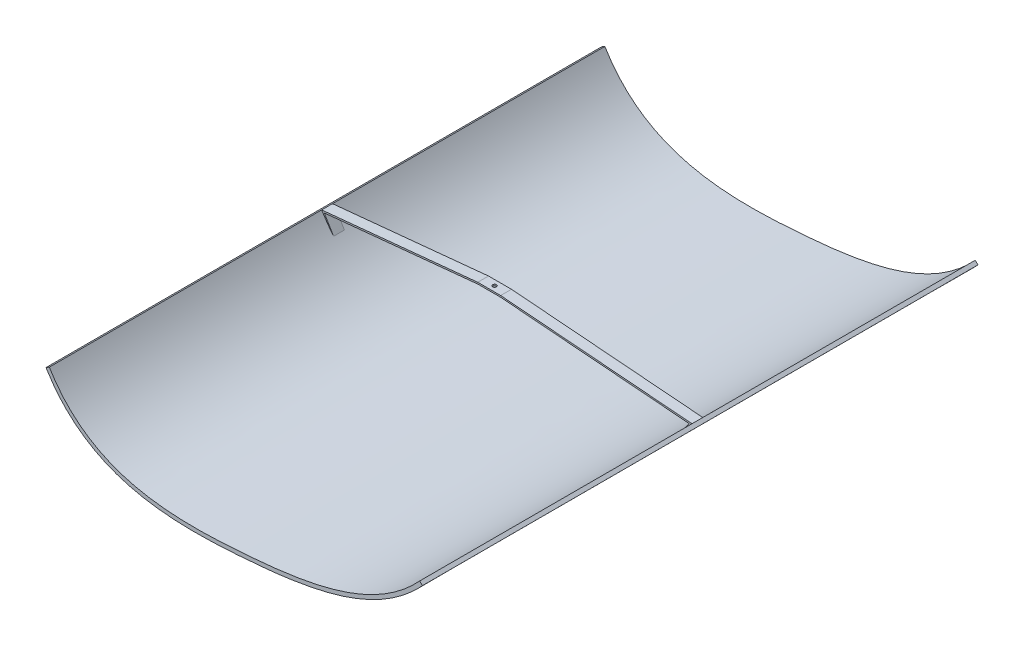
ISO-10303-21;
HEADER;
FILE_DESCRIPTION(('STEP AP214'),'2;1');
FILE_NAME('part.step','',(''),(''),'','','');
FILE_SCHEMA(('AUTOMOTIVE_DESIGN { 1 0 10303 214 1 1 1 1 }'));
ENDSEC;
DATA;
#1=APPLICATION_CONTEXT('core data for automotive mechanical design processes');
#2=APPLICATION_PROTOCOL_DEFINITION('international standard','automotive_design',2000,#1);
#3=PRODUCT_CONTEXT('',#1,'mechanical');
#4=PRODUCT('Part','Part','',(#3));
#5=PRODUCT_RELATED_PRODUCT_CATEGORY('part','',(#4));
#6=PRODUCT_DEFINITION_FORMATION('','',#4);
#7=PRODUCT_DEFINITION_CONTEXT('part definition',#1,'design');
#8=PRODUCT_DEFINITION('design','',#6,#7);
#9=PRODUCT_DEFINITION_SHAPE('','',#8);
#10=(LENGTH_UNIT() NAMED_UNIT(*) SI_UNIT(.MILLI.,.METRE.));
#11=(NAMED_UNIT(*) PLANE_ANGLE_UNIT() SI_UNIT($,.RADIAN.));
#12=(NAMED_UNIT(*) SI_UNIT($,.STERADIAN.) SOLID_ANGLE_UNIT());
#13=UNCERTAINTY_MEASURE_WITH_UNIT(LENGTH_MEASURE(1.E-05),#10,'distance_accuracy_value','');
#14=(GEOMETRIC_REPRESENTATION_CONTEXT(3) GLOBAL_UNCERTAINTY_ASSIGNED_CONTEXT((#13)) GLOBAL_UNIT_ASSIGNED_CONTEXT((#10,
#11,#12)) REPRESENTATION_CONTEXT('',''));
#15=CARTESIAN_POINT('',(0.,0.,0.));
#16=DIRECTION('',(0.,0.,1.));
#17=DIRECTION('',(1.,0.,0.));
#18=AXIS2_PLACEMENT_3D('',#15,#16,#17);
#19=CARTESIAN_POINT('',(-284.716135490118,-3.28498933828445,914.4));
#20=CARTESIAN_POINT('',(-276.411980171284,-17.0223440769889,914.4));
#21=CARTESIAN_POINT('',(-267.229584335889,-29.2024452882154,914.4));
#22=CARTESIAN_POINT('',(-247.338960844286,-50.7240263520773,914.4));
#23=CARTESIAN_POINT('',(-236.63146433516,-60.0642705488544,914.4));
#24=CARTESIAN_POINT('',(-213.956642450282,-76.1993515181385,914.4));
#25=CARTESIAN_POINT('',(-201.990613754382,-82.9942455509838,914.4));
#26=CARTESIAN_POINT('',(-177.065513095476,-94.373588625778,914.4));
#27=CARTESIAN_POINT('',(-164.106747151635,-98.9589092430839,914.4));
#28=CARTESIAN_POINT('',(-137.435337906107,-106.278074264597,914.4));
#29=CARTESIAN_POINT('',(-123.722298844139,-109.012434746504,914.4));
#30=CARTESIAN_POINT('',(-95.7575404753767,-112.988332752514,914.4));
#31=CARTESIAN_POINT('',(-81.5054413403796,-114.229947252524,914.4));
#32=CARTESIAN_POINT('',(-38.2488208925515,-116.240274168026,914.4));
#33=CARTESIAN_POINT('',(-8.74218363582349,-115.296775681338,914.4));
#34=CARTESIAN_POINT('',(27.9507179716041,-112.960198025047,914.4));
#35=CARTESIAN_POINT('',(35.2787920719414,-112.434976438823,914.4));
#36=CARTESIAN_POINT('',(49.8932412438578,-111.309686323291,914.4));
#37=CARTESIAN_POINT('',(57.1884339157507,-110.707434609322,914.4));
#38=CARTESIAN_POINT('',(79.0132676113584,-108.733315329445,914.4));
#39=CARTESIAN_POINT('',(93.4821538183719,-107.194182238308,914.4));
#40=CARTESIAN_POINT('',(136.449530574275,-101.516065662464,914.4));
#41=CARTESIAN_POINT('',(164.510554880142,-96.3182673204773,914.4));
#42=CARTESIAN_POINT('',(204.929228546462,-84.8052344162597,914.4));
#43=CARTESIAN_POINT('',(218.12301669191,-80.347603619285,914.4));
#44=CARTESIAN_POINT('',(243.810120822204,-69.9225901114651,914.4));
#45=CARTESIAN_POINT('',(256.30350073932,-63.9549464320951,914.4));
#46=CARTESIAN_POINT('',(280.43644047674,-50.2434535762098,914.4));
#47=CARTESIAN_POINT('',(292.075782994841,-42.4993308631992,914.4));
#48=CARTESIAN_POINT('',(314.337533524157,-24.9808423082727,914.4));
#49=CARTESIAN_POINT('',(324.959480173604,-15.2065106312622,914.4));
#50=CARTESIAN_POINT('',(334.991900125826,-4.29865815558271,914.4));
#51=B_SPLINE_CURVE_WITH_KNOTS('',3,(#19,#20,#21,#22,#23,#24,#25,#26,#27,#28,#29,#30,#31,#32,#33,
#34,#35,#36,#37,#38,#39,#40,#41,#42,#43,#44,#45,#46,#47,#48,#49,#50),.UNSPECIFIED.,.F.,.F.,(4,2,
2,2,2,2,2,2,2,2,2,2,2,2,2,4),(0.,0.0625,0.125,0.1875,0.25,0.3125,0.375,0.5,0.53125,0.5625,0.625,
0.75,0.8125,0.875,0.9375,1.),.UNSPECIFIED.);
#52=DIRECTION('',(0.,0.,-1.));
#53=VECTOR('',#52,1.);
#54=SURFACE_OF_LINEAR_EXTRUSION('',#51,#53);
#55=CARTESIAN_POINT('',(-284.716135490118,-3.28498933828445,0.));
#56=CARTESIAN_POINT('',(-276.411980171284,-17.0223440769889,0.));
#57=CARTESIAN_POINT('',(-267.229584335889,-29.2024452882154,0.));
#58=CARTESIAN_POINT('',(-247.338960844286,-50.7240263520773,0.));
#59=CARTESIAN_POINT('',(-236.63146433516,-60.0642705488544,0.));
#60=CARTESIAN_POINT('',(-213.956642450282,-76.1993515181385,0.));
#61=CARTESIAN_POINT('',(-201.990613754382,-82.9942455509838,0.));
#62=CARTESIAN_POINT('',(-177.065513095476,-94.373588625778,0.));
#63=CARTESIAN_POINT('',(-164.106747151635,-98.9589092430839,0.));
#64=CARTESIAN_POINT('',(-137.435337906107,-106.278074264597,0.));
#65=CARTESIAN_POINT('',(-123.722298844139,-109.012434746504,0.));
#66=CARTESIAN_POINT('',(-95.7575404753767,-112.988332752514,0.));
#67=CARTESIAN_POINT('',(-81.5054413403796,-114.229947252524,0.));
#68=CARTESIAN_POINT('',(-38.2488208925515,-116.240274168026,0.));
#69=CARTESIAN_POINT('',(-8.74218363582349,-115.296775681338,0.));
#70=CARTESIAN_POINT('',(27.9507179716041,-112.960198025047,0.));
#71=CARTESIAN_POINT('',(35.2787920719414,-112.434976438823,0.));
#72=CARTESIAN_POINT('',(49.8932412438578,-111.309686323291,0.));
#73=CARTESIAN_POINT('',(57.1884339157507,-110.707434609322,0.));
#74=CARTESIAN_POINT('',(79.0132676113584,-108.733315329445,0.));
#75=CARTESIAN_POINT('',(93.4821538183719,-107.194182238308,0.));
#76=CARTESIAN_POINT('',(136.449530574275,-101.516065662464,0.));
#77=CARTESIAN_POINT('',(164.510554880142,-96.3182673204773,0.));
#78=CARTESIAN_POINT('',(204.929228546462,-84.8052344162597,0.));
#79=CARTESIAN_POINT('',(218.12301669191,-80.347603619285,0.));
#80=CARTESIAN_POINT('',(243.810120822204,-69.9225901114651,0.));
#81=CARTESIAN_POINT('',(256.30350073932,-63.9549464320951,0.));
#82=CARTESIAN_POINT('',(280.43644047674,-50.2434535762098,0.));
#83=CARTESIAN_POINT('',(292.075782994841,-42.4993308631992,0.));
#84=CARTESIAN_POINT('',(314.337533524157,-24.9808423082727,0.));
#85=CARTESIAN_POINT('',(324.959480173604,-15.2065106312622,0.));
#86=CARTESIAN_POINT('',(334.991900125826,-4.29865815558271,0.));
#87=B_SPLINE_CURVE_WITH_KNOTS('',3,(#55,#56,#57,#58,#59,#60,#61,#62,#63,#64,#65,#66,#67,#68,#69,
#70,#71,#72,#73,#74,#75,#76,#77,#78,#79,#80,#81,#82,#83,#84,#85,#86),.UNSPECIFIED.,.F.,.F.,(4,2,
2,2,2,2,2,2,2,2,2,2,2,2,2,4),(0.,0.0625,0.125,0.1875,0.25,0.3125,0.375,0.5,0.53125,0.5625,0.625,
0.75,0.8125,0.875,0.9375,1.),.UNSPECIFIED.);
#88=CARTESIAN_POINT('',(-284.716135490118,-3.28498933828445,0.));
#89=VERTEX_POINT('',#88);
#90=CARTESIAN_POINT('',(334.991900125826,-4.29865815558276,0.));
#91=VERTEX_POINT('',#90);
#92=EDGE_CURVE('E279',#89,#91,#87,.T.);
#93=ORIENTED_EDGE('',*,*,#92,.T.);
#94=DIRECTION('',(0.,0.,-1.));
#95=VECTOR('',#94,1.);
#96=CARTESIAN_POINT('',(334.991900125826,-4.29865815558276,914.4));
#97=LINE('',#96,#95);
#98=CARTESIAN_POINT('',(334.991900125826,-4.29865815558276,914.4));
#99=VERTEX_POINT('',#98);
#100=EDGE_CURVE('E181',#99,#91,#97,.T.);
#101=ORIENTED_EDGE('',*,*,#100,.F.);
#102=CARTESIAN_POINT('',(-284.716135490118,-3.28498933828445,914.4));
#103=VERTEX_POINT('',#102);
#104=EDGE_CURVE('E242',#103,#99,#51,.T.);
#105=ORIENTED_EDGE('',*,*,#104,.F.);
#106=DIRECTION('',(0.,0.,-1.));
#107=VECTOR('',#106,1.);
#108=CARTESIAN_POINT('',(-284.716135490118,-3.28498933828445,914.4));
#109=LINE('',#108,#107);
#110=EDGE_CURVE('E222',#103,#89,#109,.T.);
#111=ORIENTED_EDGE('',*,*,#110,.T.);
#112=EDGE_LOOP('',(#93,#101,#105,#111));
#113=FACE_BOUND('',#112,.T.);
#114=ADVANCED_FACE('F39',(#113),#54,.F.);
#115=CARTESIAN_POINT('',(330.318139534884,0.,914.4));
#116=DIRECTION('',(0.676954040249254,0.736025289912114,0.));
#117=DIRECTION('',(-0.736025289912114,0.676954040249254,0.));
#118=AXIS2_PLACEMENT_3D('',#115,#116,#117);
#119=PLANE('',#118);
#120=DIRECTION('',(0.736025289912114,-0.676954040249254,0.));
#121=VECTOR('',#120,1.);
#122=CARTESIAN_POINT('',(330.318139534884,0.,0.));
#123=LINE('',#122,#121);
#124=CARTESIAN_POINT('',(330.318139534884,0.,0.));
#125=VERTEX_POINT('',#124);
#126=EDGE_CURVE('E284',#125,#91,#123,.T.);
#127=ORIENTED_EDGE('',*,*,#126,.F.);
#128=DIRECTION('',(0.,0.,-1.));
#129=VECTOR('',#128,1.);
#130=CARTESIAN_POINT('',(330.318139534884,0.,914.4));
#131=LINE('',#130,#129);
#132=CARTESIAN_POINT('',(330.318139534884,0.,448.31));
#133=VERTEX_POINT('',#132);
#134=EDGE_CURVE('E172',#133,#125,#131,.T.);
#135=ORIENTED_EDGE('',*,*,#134,.F.);
#136=DIRECTION('',(0.,0.,1.));
#137=VECTOR('',#136,1.);
#138=CARTESIAN_POINT('',(330.318139534884,0.,448.31));
#139=LINE('',#138,#137);
#140=CARTESIAN_POINT('',(330.318139534884,0.,466.09));
#141=VERTEX_POINT('',#140);
#142=EDGE_CURVE('E158',#133,#141,#139,.T.);
#143=ORIENTED_EDGE('',*,*,#142,.T.);
#144=CARTESIAN_POINT('',(330.318139534884,0.,914.4));
#145=VERTEX_POINT('',#144);
#146=EDGE_CURVE('E170',#145,#141,#131,.T.);
#147=ORIENTED_EDGE('',*,*,#146,.F.);
#148=DIRECTION('',(0.736025289912114,-0.676954040249254,0.));
#149=VECTOR('',#148,1.);
#150=CARTESIAN_POINT('',(330.318139534884,0.,914.4));
#151=LINE('',#150,#149);
#152=EDGE_CURVE('E248',#145,#99,#151,.T.);
#153=ORIENTED_EDGE('',*,*,#152,.T.);
#154=ORIENTED_EDGE('',*,*,#100,.T.);
#155=EDGE_LOOP('',(#127,#135,#143,#147,#153,#154));
#156=FACE_BOUND('',#155,.T.);
#157=ADVANCED_FACE('F168',(#156),#119,.T.);
#158=CARTESIAN_POINT('',(-279.281860465116,0.,914.4));
#159=CARTESIAN_POINT('',(-210.683269989052,-113.480918379199,914.4));
#160=CARTESIAN_POINT('',(31.4120390236031,-116.473776401839,914.4));
#161=CARTESIAN_POINT('',(256.595063056798,-80.1561782806055,914.4));
#162=CARTESIAN_POINT('',(330.318139534884,0.,914.4));
#163=B_SPLINE_CURVE_WITH_KNOTS('',3,(#158,#159,#160,#161,#162),.UNSPECIFIED.,.F.,.F.,(4,1,4),
(0.,0.529840137333188,1.),.UNSPECIFIED.);
#164=DIRECTION('',(0.,0.,-1.));
#165=VECTOR('',#164,1.);
#166=SURFACE_OF_LINEAR_EXTRUSION('',#163,#165);
#167=CARTESIAN_POINT('',(-279.281860465116,0.,448.31));
#168=CARTESIAN_POINT('',(-210.683269989052,-113.480918379199,448.31));
#169=CARTESIAN_POINT('',(31.4120390236031,-116.473776401839,448.31));
#170=CARTESIAN_POINT('',(256.595063056798,-80.1561782806055,448.31));
#171=CARTESIAN_POINT('',(330.318139534884,0.,448.31));
#172=B_SPLINE_CURVE_WITH_KNOTS('',3,(#167,#168,#169,#170,#171),.UNSPECIFIED.,.F.,.F.,(4,1,4),
(0.,0.529840137333188,1.),.UNSPECIFIED.);
#173=CARTESIAN_POINT('',(318.801859383223,-11.7688638609764,448.31));
#174=VERTEX_POINT('',#173);
#175=EDGE_CURVE('E11',#133,#174,#172,.F.);
#176=ORIENTED_EDGE('',*,*,#175,.F.);
#177=ORIENTED_EDGE('',*,*,#134,.T.);
#178=CARTESIAN_POINT('',(-279.281860465116,0.,0.));
#179=CARTESIAN_POINT('',(-210.683269989052,-113.480918379199,0.));
#180=CARTESIAN_POINT('',(31.4120390236031,-116.473776401839,0.));
#181=CARTESIAN_POINT('',(256.595063056798,-80.1561782806055,0.));
#182=CARTESIAN_POINT('',(330.318139534884,0.,0.));
#183=B_SPLINE_CURVE_WITH_KNOTS('',3,(#178,#179,#180,#181,#182),.UNSPECIFIED.,.F.,.F.,(4,1,4),
(0.,0.529840137333188,1.),.UNSPECIFIED.);
#184=CARTESIAN_POINT('',(-279.281860465116,0.,0.));
#185=VERTEX_POINT('',#184);
#186=EDGE_CURVE('E217',#185,#125,#183,.T.);
#187=ORIENTED_EDGE('',*,*,#186,.F.);
#188=DIRECTION('',(0.,0.,-1.));
#189=VECTOR('',#188,1.);
#190=CARTESIAN_POINT('',(-279.281860465116,0.,914.4));
#191=LINE('',#190,#189);
#192=CARTESIAN_POINT('',(-279.281860465116,0.,448.31));
#193=VERTEX_POINT('',#192);
#194=EDGE_CURVE('E214',#193,#185,#191,.T.);
#195=ORIENTED_EDGE('',*,*,#194,.F.);
#196=CARTESIAN_POINT('',(-259.574938061757,-27.7337172618055,448.31));
#197=VERTEX_POINT('',#196);
#198=EDGE_CURVE('E49',#197,#193,#172,.F.);
#199=ORIENTED_EDGE('',*,*,#198,.F.);
#200=DIRECTION('',(0.,0.,-1.));
#201=VECTOR('',#200,1.);
#202=CARTESIAN_POINT('',(-259.574938094457,-27.7337172076301,914.4));
#203=LINE('',#202,#201);
#204=CARTESIAN_POINT('',(-259.574938061757,-27.7337172618055,466.09));
#205=VERTEX_POINT('',#204);
#206=EDGE_CURVE('E194',#205,#197,#203,.T.);
#207=ORIENTED_EDGE('',*,*,#206,.F.);
#208=CARTESIAN_POINT('',(-279.281860465116,0.,466.09));
#209=CARTESIAN_POINT('',(-210.683269989052,-113.480918379199,466.09));
#210=CARTESIAN_POINT('',(31.4120390236031,-116.473776401839,466.09));
#211=CARTESIAN_POINT('',(256.595063056798,-80.1561782806055,466.09));
#212=CARTESIAN_POINT('',(330.318139534884,0.,466.09));
#213=B_SPLINE_CURVE_WITH_KNOTS('',3,(#208,#209,#210,#211,#212),.UNSPECIFIED.,.F.,.F.,(4,1,4),
(0.,0.529840137333188,1.),.UNSPECIFIED.);
#214=CARTESIAN_POINT('',(-279.281860465116,0.,466.09));
#215=VERTEX_POINT('',#214);
#216=EDGE_CURVE('E152',#205,#215,#213,.F.);
#217=ORIENTED_EDGE('',*,*,#216,.T.);
#218=CARTESIAN_POINT('',(-279.281860465116,0.,914.4));
#219=VERTEX_POINT('',#218);
#220=EDGE_CURVE('E186',#219,#215,#191,.T.);
#221=ORIENTED_EDGE('',*,*,#220,.F.);
#222=EDGE_CURVE('E179',#219,#145,#163,.T.);
#223=ORIENTED_EDGE('',*,*,#222,.T.);
#224=ORIENTED_EDGE('',*,*,#146,.T.);
#225=CARTESIAN_POINT('',(318.801859383368,-11.7688638610801,466.09));
#226=VERTEX_POINT('',#225);
#227=EDGE_CURVE('E141',#141,#226,#213,.F.);
#228=ORIENTED_EDGE('',*,*,#227,.T.);
#229=DIRECTION('',(0.,0.,-1.));
#230=VECTOR('',#229,1.);
#231=CARTESIAN_POINT('',(318.801859382677,-11.7688638617441,914.4));
#232=LINE('',#231,#230);
#233=EDGE_CURVE('E43',#174,#226,#232,.F.);
#234=ORIENTED_EDGE('',*,*,#233,.F.);
#235=EDGE_LOOP('',(#176,#177,#187,#195,#199,#207,#217,#221,#223,#224,#228,#234));
#236=FACE_BOUND('',#235,.T.);
#237=ADVANCED_FACE('F177',(#236),#166,.T.);
#238=CARTESIAN_POINT('',(-284.716135490118,-3.28498933828445,914.4));
#239=DIRECTION('',(-0.517321155635347,0.855791342519956,0.));
#240=DIRECTION('',(-0.855791342519956,-0.517321155635347,0.));
#241=AXIS2_PLACEMENT_3D('',#238,#239,#240);
#242=PLANE('',#241);
#243=DIRECTION('',(0.855791342519956,0.517321155635347,0.));
#244=VECTOR('',#243,1.);
#245=CARTESIAN_POINT('',(-284.716135490118,-3.28498933828445,0.));
#246=LINE('',#245,#244);
#247=EDGE_CURVE('E249',#89,#185,#246,.T.);
#248=ORIENTED_EDGE('',*,*,#247,.F.);
#249=ORIENTED_EDGE('',*,*,#110,.F.);
#250=DIRECTION('',(0.855791342519956,0.517321155635347,0.));
#251=VECTOR('',#250,1.);
#252=CARTESIAN_POINT('',(-284.716135490118,-3.28498933828445,914.4));
#253=LINE('',#252,#251);
#254=EDGE_CURVE('E260',#103,#219,#253,.T.);
#255=ORIENTED_EDGE('',*,*,#254,.T.);
#256=ORIENTED_EDGE('',*,*,#220,.T.);
#257=DIRECTION('',(0.,0.,1.));
#258=VECTOR('',#257,1.);
#259=CARTESIAN_POINT('',(-279.281860465116,0.,448.31));
#260=LINE('',#259,#258);
#261=EDGE_CURVE('E224',#193,#215,#260,.T.);
#262=ORIENTED_EDGE('',*,*,#261,.F.);
#263=ORIENTED_EDGE('',*,*,#194,.T.);
#264=EDGE_LOOP('',(#248,#249,#255,#256,#262,#263));
#265=FACE_BOUND('',#264,.T.);
#266=ADVANCED_FACE('F225',(#265),#242,.T.);
#267=CARTESIAN_POINT('',(20.6121376501186,-113.427513556305,914.4));
#268=DIRECTION('',(0.,0.,-1.));
#269=DIRECTION('',(-1.,0.,0.));
#270=AXIS2_PLACEMENT_3D('',#267,#268,#269);
#271=PLANE('',#270);
#272=ORIENTED_EDGE('',*,*,#104,.T.);
#273=ORIENTED_EDGE('',*,*,#152,.F.);
#274=ORIENTED_EDGE('',*,*,#222,.F.);
#275=ORIENTED_EDGE('',*,*,#254,.F.);
#276=EDGE_LOOP('',(#272,#273,#274,#275));
#277=FACE_BOUND('',#276,.T.);
#278=ADVANCED_FACE('F304',(#277),#271,.F.);
#279=CARTESIAN_POINT('',(20.6121376501186,-113.427513556305,0.));
#280=DIRECTION('',(0.,0.,-1.));
#281=DIRECTION('',(-1.,0.,0.));
#282=AXIS2_PLACEMENT_3D('',#279,#280,#281);
#283=PLANE('',#282);
#284=ORIENTED_EDGE('',*,*,#92,.F.);
#285=ORIENTED_EDGE('',*,*,#247,.T.);
#286=ORIENTED_EDGE('',*,*,#186,.T.);
#287=ORIENTED_EDGE('',*,*,#126,.T.);
#288=EDGE_LOOP('',(#284,#285,#286,#287));
#289=FACE_BOUND('',#288,.T.);
#290=ADVANCED_FACE('F286',(#289),#283,.T.);
#291=CARTESIAN_POINT('',(328.250410184973,1.47515942715212,448.31));
#292=DIRECTION('',(-0.814066673193394,0.580771428012639,0.));
#293=DIRECTION('',(-0.580771428012639,-0.814066673193394,0.));
#294=AXIS2_PLACEMENT_3D('',#291,#292,#293);
#295=PLANE('',#294);
#296=DIRECTION('',(-0.580771428012639,-0.814066673193394,0.));
#297=VECTOR('',#296,1.);
#298=CARTESIAN_POINT('',(328.250410184973,1.47515942715212,448.31));
#299=LINE('',#298,#297);
#300=CARTESIAN_POINT('',(325.647772164739,-2.17295542916639,448.31));
#301=VERTEX_POINT('',#300);
#302=EDGE_CURVE('E383',#301,#174,#299,.T.);
#303=ORIENTED_EDGE('',*,*,#302,.T.);
#304=ORIENTED_EDGE('',*,*,#233,.T.);
#305=DIRECTION('',(-0.580771428012639,-0.814066673193394,0.));
#306=VECTOR('',#305,1.);
#307=CARTESIAN_POINT('',(328.250410184973,1.47515942715212,466.09));
#308=LINE('',#307,#306);
#309=CARTESIAN_POINT('',(325.647772164739,-2.17295542916639,466.09));
#310=VERTEX_POINT('',#309);
#311=EDGE_CURVE('E56',#310,#226,#308,.T.);
#312=ORIENTED_EDGE('',*,*,#311,.F.);
#313=DIRECTION('',(0.,0.,1.));
#314=VECTOR('',#313,1.);
#315=CARTESIAN_POINT('',(325.647772164739,-2.17295542916639,448.31));
#316=LINE('',#315,#314);
#317=EDGE_CURVE('E285',#301,#310,#316,.T.);
#318=ORIENTED_EDGE('',*,*,#317,.F.);
#319=EDGE_LOOP('',(#303,#304,#312,#318));
#320=FACE_BOUND('',#319,.T.);
#321=ADVANCED_FACE('F311',(#320),#295,.T.);
#322=CARTESIAN_POINT('',(15.1911817248759,22.7699128460438,448.31));
#323=DIRECTION('',(-0.0800844773282996,-0.996788080030582,0.));
#324=DIRECTION('',(0.996788080030582,-0.0800844773282997,0.));
#325=AXIS2_PLACEMENT_3D('',#322,#323,#324);
#326=PLANE('',#325);
#327=ORIENTED_EDGE('',*,*,#317,.T.);
#328=DIRECTION('',(0.996788080030582,-0.0800844773282997,0.));
#329=VECTOR('',#328,1.);
#330=CARTESIAN_POINT('',(15.1911817248759,22.7699128460438,466.09));
#331=LINE('',#330,#329);
#332=CARTESIAN_POINT('',(15.292725410515,22.7617545693214,466.09));
#333=VERTEX_POINT('',#332);
#334=EDGE_CURVE('E380',#333,#310,#331,.T.);
#335=ORIENTED_EDGE('',*,*,#334,.F.);
#336=DIRECTION('',(0.,0.,1.));
#337=VECTOR('',#336,1.);
#338=CARTESIAN_POINT('',(15.292725410515,22.7617545693214,448.31));
#339=LINE('',#338,#337);
#340=CARTESIAN_POINT('',(15.292725410515,22.7617545693214,448.31));
#341=VERTEX_POINT('',#340);
#342=EDGE_CURVE('E410',#341,#333,#339,.T.);
#343=ORIENTED_EDGE('',*,*,#342,.F.);
#344=DIRECTION('',(0.996788080030582,-0.0800844773282997,0.));
#345=VECTOR('',#344,1.);
#346=CARTESIAN_POINT('',(15.1911817248759,22.7699128460438,448.31));
#347=LINE('',#346,#345);
#348=EDGE_CURVE('E174',#341,#301,#347,.T.);
#349=ORIENTED_EDGE('',*,*,#348,.T.);
#350=EDGE_LOOP('',(#327,#335,#343,#349));
#351=FACE_BOUND('',#350,.T.);
#352=ADVANCED_FACE('F315',(#351),#326,.T.);
#353=CARTESIAN_POINT('',(-22.4020603556161,22.7617545693214,448.31));
#354=DIRECTION('',(0.,-1.,0.));
#355=DIRECTION('',(0.,0.,-1.));
#356=AXIS2_PLACEMENT_3D('',#353,#354,#355);
#357=PLANE('',#356);
#358=CARTESIAN_POINT('',(-3.50373202916317,22.7617545693214,457.2));
#359=DIRECTION('',(0.,-1.,0.));
#360=DIRECTION('',(0.,0.,-1.));
#361=AXIS2_PLACEMENT_3D('',#358,#359,#360);
#362=CIRCLE('',#361,3.175);
#363=CARTESIAN_POINT('',(-3.50373202916317,22.7617545693214,454.025));
#364=VERTEX_POINT('',#363);
#365=EDGE_CURVE('E356',#364,#364,#362,.F.);
#366=ORIENTED_EDGE('',*,*,#365,.T.);
#367=EDGE_LOOP('',(#366));
#368=FACE_BOUND('',#367,.T.);
#369=ORIENTED_EDGE('',*,*,#342,.T.);
#370=DIRECTION('',(1.,0.,0.));
#371=VECTOR('',#370,1.);
#372=CARTESIAN_POINT('',(-22.4020603556161,22.7617545693214,466.09));
#373=LINE('',#372,#371);
#374=CARTESIAN_POINT('',(-22.2772717638816,22.7617545693214,466.09));
#375=VERTEX_POINT('',#374);
#376=EDGE_CURVE('E376',#375,#333,#373,.T.);
#377=ORIENTED_EDGE('',*,*,#376,.F.);
#378=DIRECTION('',(0.,0.,1.));
#379=VECTOR('',#378,1.);
#380=CARTESIAN_POINT('',(-22.2772717638816,22.7617545693214,448.31));
#381=LINE('',#380,#379);
#382=CARTESIAN_POINT('',(-22.2772717638816,22.7617545693214,448.31));
#383=VERTEX_POINT('',#382);
#384=EDGE_CURVE('E236',#383,#375,#381,.T.);
#385=ORIENTED_EDGE('',*,*,#384,.F.);
#386=DIRECTION('',(1.,0.,0.));
#387=VECTOR('',#386,1.);
#388=CARTESIAN_POINT('',(-22.4020603556161,22.7617545693214,448.31));
#389=LINE('',#388,#387);
#390=EDGE_CURVE('E401',#383,#341,#389,.T.);
#391=ORIENTED_EDGE('',*,*,#390,.T.);
#392=EDGE_LOOP('',(#369,#377,#385,#391));
#393=FACE_BOUND('',#392,.T.);
#394=ADVANCED_FACE('F333',(#368,#393),#357,.T.);
#395=CARTESIAN_POINT('',(-279.032884234252,-2.52776795542329,448.31));
#396=DIRECTION('',(0.0980221381353633,-0.995184234418618,0.));
#397=DIRECTION('',(0.995184234418619,0.0980221381353633,0.));
#398=AXIS2_PLACEMENT_3D('',#395,#396,#397);
#399=PLANE('',#398);
#400=ORIENTED_EDGE('',*,*,#384,.T.);
#401=DIRECTION('',(0.995184234418619,0.0980221381353633,0.));
#402=VECTOR('',#401,1.);
#403=CARTESIAN_POINT('',(-279.032884234252,-2.52776795542329,466.09));
#404=LINE('',#403,#402);
#405=CARTESIAN_POINT('',(-275.027395984956,-2.13324148595861,466.09));
#406=VERTEX_POINT('',#405);
#407=EDGE_CURVE('E372',#406,#375,#404,.T.);
#408=ORIENTED_EDGE('',*,*,#407,.F.);
#409=DIRECTION('',(0.,0.,1.));
#410=VECTOR('',#409,1.);
#411=CARTESIAN_POINT('',(-275.027395984956,-2.13324148595861,448.31));
#412=LINE('',#411,#410);
#413=CARTESIAN_POINT('',(-275.027395984956,-2.13324148595861,448.31));
#414=VERTEX_POINT('',#413);
#415=EDGE_CURVE('E230',#414,#406,#412,.T.);
#416=ORIENTED_EDGE('',*,*,#415,.F.);
#417=DIRECTION('',(0.995184234418619,0.0980221381353633,0.));
#418=VECTOR('',#417,1.);
#419=CARTESIAN_POINT('',(-279.032884234252,-2.52776795542329,448.31));
#420=LINE('',#419,#418);
#421=EDGE_CURVE('E397',#414,#383,#420,.T.);
#422=ORIENTED_EDGE('',*,*,#421,.T.);
#423=EDGE_LOOP('',(#400,#408,#416,#422));
#424=FACE_BOUND('',#423,.T.);
#425=ADVANCED_FACE('F329',(#424),#399,.T.);
#426=CARTESIAN_POINT('',(-277.107290173953,1.31257154044571,448.31));
#427=DIRECTION('',(0.856130035891239,0.516760448994373,0.));
#428=DIRECTION('',(-0.516760448994373,0.856130035891239,0.));
#429=AXIS2_PLACEMENT_3D('',#426,#427,#428);
#430=PLANE('',#429);
#431=DIRECTION('',(-0.516760448994373,0.856130035891239,0.));
#432=VECTOR('',#431,1.);
#433=CARTESIAN_POINT('',(-277.107290173953,1.31257154044571,466.09));
#434=LINE('',#433,#432);
#435=EDGE_CURVE('E369',#205,#406,#434,.T.);
#436=ORIENTED_EDGE('',*,*,#435,.F.);
#437=ORIENTED_EDGE('',*,*,#206,.T.);
#438=DIRECTION('',(-0.516760448994373,0.856130035891239,0.));
#439=VECTOR('',#438,1.);
#440=CARTESIAN_POINT('',(-277.107290173953,1.31257154044571,448.31));
#441=LINE('',#440,#439);
#442=EDGE_CURVE('E211',#197,#414,#441,.T.);
#443=ORIENTED_EDGE('',*,*,#442,.T.);
#444=ORIENTED_EDGE('',*,*,#415,.T.);
#445=EDGE_LOOP('',(#436,#437,#443,#444));
#446=FACE_BOUND('',#445,.T.);
#447=ADVANCED_FACE('F326',(#446),#430,.T.);
#448=CARTESIAN_POINT('',(-279.281860465116,0.,448.31));
#449=DIRECTION('',(0.0980221381353633,-0.995184234418618,0.));
#450=DIRECTION('',(0.995184234418619,0.0980221381353633,0.));
#451=AXIS2_PLACEMENT_3D('',#448,#449,#450);
#452=PLANE('',#451);
#453=ORIENTED_EDGE('',*,*,#261,.T.);
#454=DIRECTION('',(0.995184234418618,0.0980221381353633,0.));
#455=VECTOR('',#454,1.);
#456=CARTESIAN_POINT('',(-279.281860465116,0.,466.09));
#457=LINE('',#456,#455);
#458=CARTESIAN_POINT('',(-22.4020603556161,25.3017545693214,466.09));
#459=VERTEX_POINT('',#458);
#460=EDGE_CURVE('E366',#215,#459,#457,.T.);
#461=ORIENTED_EDGE('',*,*,#460,.T.);
#462=DIRECTION('',(0.,0.,1.));
#463=VECTOR('',#462,1.);
#464=CARTESIAN_POINT('',(-22.4020603556161,25.3017545693214,448.31));
#465=LINE('',#464,#463);
#466=CARTESIAN_POINT('',(-22.4020603556161,25.3017545693214,448.31));
#467=VERTEX_POINT('',#466);
#468=EDGE_CURVE('E231',#467,#459,#465,.T.);
#469=ORIENTED_EDGE('',*,*,#468,.F.);
#470=DIRECTION('',(0.995184234418618,0.0980221381353633,0.));
#471=VECTOR('',#470,1.);
#472=CARTESIAN_POINT('',(-279.281860465116,0.,448.31));
#473=LINE('',#472,#471);
#474=EDGE_CURVE('E64',#193,#467,#473,.T.);
#475=ORIENTED_EDGE('',*,*,#474,.F.);
#476=EDGE_LOOP('',(#453,#461,#469,#475));
#477=FACE_BOUND('',#476,.T.);
#478=ADVANCED_FACE('F322',(#477),#452,.F.);
#479=CARTESIAN_POINT('',(-22.4020603556161,25.3017545693214,448.31));
#480=DIRECTION('',(0.,-1.,0.));
#481=DIRECTION('',(0.,0.,-1.));
#482=AXIS2_PLACEMENT_3D('',#479,#480,#481);
#483=PLANE('',#482);
#484=CARTESIAN_POINT('',(-3.50373202916317,25.3017545693214,457.2));
#485=DIRECTION('',(0.,1.,0.));
#486=DIRECTION('',(0.,0.,1.));
#487=AXIS2_PLACEMENT_3D('',#484,#485,#486);
#488=CIRCLE('',#487,3.175);
#489=CARTESIAN_POINT('',(-3.50373202916317,25.3017545693214,460.375));
#490=VERTEX_POINT('',#489);
#491=EDGE_CURVE('E353',#490,#490,#488,.T.);
#492=ORIENTED_EDGE('',*,*,#491,.F.);
#493=EDGE_LOOP('',(#492));
#494=FACE_BOUND('',#493,.T.);
#495=ORIENTED_EDGE('',*,*,#468,.T.);
#496=DIRECTION('',(1.,0.,0.));
#497=VECTOR('',#496,1.);
#498=CARTESIAN_POINT('',(-22.4020603556161,25.3017545693214,466.09));
#499=LINE('',#498,#497);
#500=CARTESIAN_POINT('',(15.3945962972897,25.3017545693214,466.09));
#501=VERTEX_POINT('',#500);
#502=EDGE_CURVE('E163',#459,#501,#499,.T.);
#503=ORIENTED_EDGE('',*,*,#502,.T.);
#504=DIRECTION('',(0.,0.,1.));
#505=VECTOR('',#504,1.);
#506=CARTESIAN_POINT('',(15.3945962972897,25.3017545693214,448.31));
#507=LINE('',#506,#505);
#508=CARTESIAN_POINT('',(15.3945962972897,25.3017545693214,448.31));
#509=VERTEX_POINT('',#508);
#510=EDGE_CURVE('E161',#509,#501,#507,.T.);
#511=ORIENTED_EDGE('',*,*,#510,.F.);
#512=DIRECTION('',(1.,0.,0.));
#513=VECTOR('',#512,1.);
#514=CARTESIAN_POINT('',(-22.4020603556161,25.3017545693214,448.31));
#515=LINE('',#514,#513);
#516=EDGE_CURVE('E390',#467,#509,#515,.T.);
#517=ORIENTED_EDGE('',*,*,#516,.F.);
#518=EDGE_LOOP('',(#495,#503,#511,#517));
#519=FACE_BOUND('',#518,.T.);
#520=ADVANCED_FACE('F319',(#494,#519),#483,.F.);
#521=CARTESIAN_POINT('',(15.3945962972897,25.3017545693214,448.31));
#522=DIRECTION('',(-0.0800844773282997,-0.996788080030582,0.));
#523=DIRECTION('',(0.996788080030582,-0.0800844773282997,0.));
#524=AXIS2_PLACEMENT_3D('',#521,#522,#523);
#525=PLANE('',#524);
#526=ORIENTED_EDGE('',*,*,#510,.T.);
#527=DIRECTION('',(0.996788080030582,-0.0800844773282997,0.));
#528=VECTOR('',#527,1.);
#529=CARTESIAN_POINT('',(15.3945962972897,25.3017545693214,466.09));
#530=LINE('',#529,#528);
#531=EDGE_CURVE('E145',#501,#141,#530,.T.);
#532=ORIENTED_EDGE('',*,*,#531,.T.);
#533=ORIENTED_EDGE('',*,*,#142,.F.);
#534=DIRECTION('',(0.996788080030582,-0.0800844773282997,0.));
#535=VECTOR('',#534,1.);
#536=CARTESIAN_POINT('',(15.3945962972897,25.3017545693214,448.31));
#537=LINE('',#536,#535);
#538=EDGE_CURVE('E387',#509,#133,#537,.T.);
#539=ORIENTED_EDGE('',*,*,#538,.F.);
#540=EDGE_LOOP('',(#526,#532,#533,#539));
#541=FACE_BOUND('',#540,.T.);
#542=ADVANCED_FACE('F156',(#541),#525,.F.);
#543=CARTESIAN_POINT('',(0.,0.,448.31));
#544=DIRECTION('',(0.,0.,-1.));
#545=DIRECTION('',(-1.,0.,0.));
#546=AXIS2_PLACEMENT_3D('',#543,#544,#545);
#547=PLANE('',#546);
#548=ORIENTED_EDGE('',*,*,#538,.T.);
#549=ORIENTED_EDGE('',*,*,#175,.T.);
#550=ORIENTED_EDGE('',*,*,#302,.F.);
#551=ORIENTED_EDGE('',*,*,#348,.F.);
#552=ORIENTED_EDGE('',*,*,#390,.F.);
#553=ORIENTED_EDGE('',*,*,#421,.F.);
#554=ORIENTED_EDGE('',*,*,#442,.F.);
#555=ORIENTED_EDGE('',*,*,#198,.T.);
#556=ORIENTED_EDGE('',*,*,#474,.T.);
#557=ORIENTED_EDGE('',*,*,#516,.T.);
#558=EDGE_LOOP('',(#548,#549,#550,#551,#552,#553,#554,#555,#556,#557));
#559=FACE_BOUND('',#558,.T.);
#560=ADVANCED_FACE('F209',(#559),#547,.T.);
#561=CARTESIAN_POINT('',(0.,0.,466.09));
#562=DIRECTION('',(0.,0.,-1.));
#563=DIRECTION('',(-1.,0.,0.));
#564=AXIS2_PLACEMENT_3D('',#561,#562,#563);
#565=PLANE('',#564);
#566=ORIENTED_EDGE('',*,*,#227,.F.);
#567=ORIENTED_EDGE('',*,*,#531,.F.);
#568=ORIENTED_EDGE('',*,*,#502,.F.);
#569=ORIENTED_EDGE('',*,*,#460,.F.);
#570=ORIENTED_EDGE('',*,*,#216,.F.);
#571=ORIENTED_EDGE('',*,*,#435,.T.);
#572=ORIENTED_EDGE('',*,*,#407,.T.);
#573=ORIENTED_EDGE('',*,*,#376,.T.);
#574=ORIENTED_EDGE('',*,*,#334,.T.);
#575=ORIENTED_EDGE('',*,*,#311,.T.);
#576=EDGE_LOOP('',(#566,#567,#568,#569,#570,#571,#572,#573,#574,#575));
#577=FACE_BOUND('',#576,.T.);
#578=ADVANCED_FACE('F143',(#577),#565,.F.);
#579=CARTESIAN_POINT('',(-3.50373202916317,13.7814984482523,457.2));
#580=DIRECTION('',(0.,1.,0.));
#581=DIRECTION('',(0.,0.,1.));
#582=AXIS2_PLACEMENT_3D('',#579,#580,#581);
#583=CYLINDRICAL_SURFACE('',#582,3.175);
#584=ORIENTED_EDGE('',*,*,#491,.T.);
#585=EDGE_LOOP('',(#584));
#586=FACE_BOUND('',#585,.T.);
#587=ORIENTED_EDGE('',*,*,#365,.F.);
#588=EDGE_LOOP('',(#587));
#589=FACE_BOUND('',#588,.T.);
#590=ADVANCED_FACE('F345',(#586,#589),#583,.F.);
#591=CLOSED_SHELL('',(#114,#157,#237,#266,#278,#290,#321,#352,#394,#425,#447,#478,#520,#542,
#560,#578,#590));
#592=MANIFOLD_SOLID_BREP('B2',#591);
#593=ADVANCED_BREP_SHAPE_REPRESENTATION('',(#18,#592),#14);
#594=SHAPE_DEFINITION_REPRESENTATION(#9,#593);
ENDSEC;
END-ISO-10303-21;
